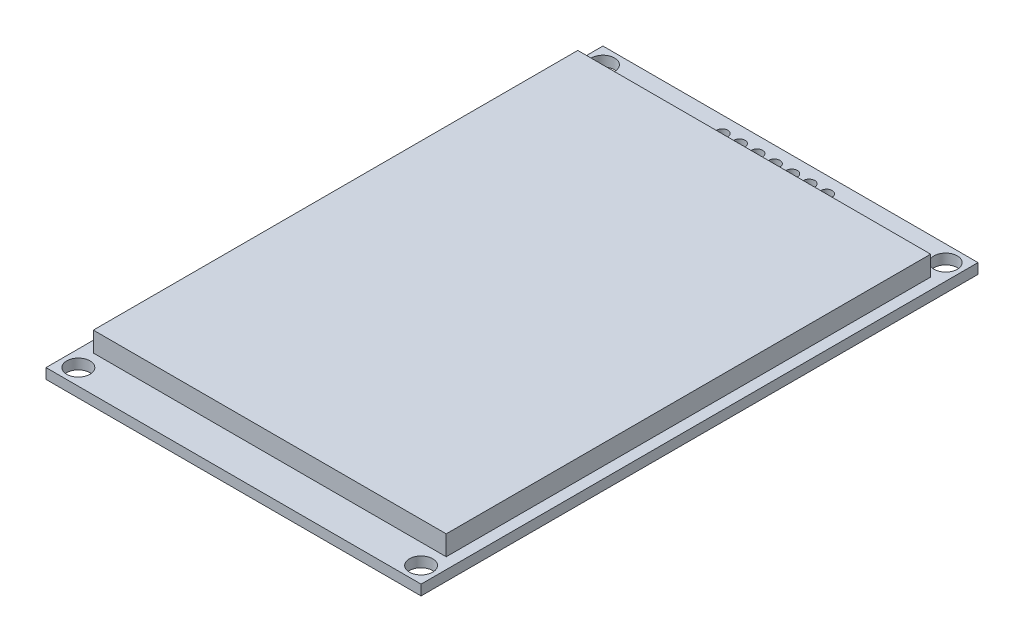
ISO-10303-21;
HEADER;
FILE_DESCRIPTION(('STEP AP214'),'2;1');
FILE_NAME('part.step','',(''),(''),'','','');
FILE_SCHEMA(('AUTOMOTIVE_DESIGN { 1 0 10303 214 1 1 1 1 }'));
ENDSEC;
DATA;
#1=APPLICATION_CONTEXT('core data for automotive mechanical design processes');
#2=APPLICATION_PROTOCOL_DEFINITION('international standard','automotive_design',2000,#1);
#3=PRODUCT_CONTEXT('',#1,'mechanical');
#4=PRODUCT('Part','Part','',(#3));
#5=PRODUCT_RELATED_PRODUCT_CATEGORY('part','',(#4));
#6=PRODUCT_DEFINITION_FORMATION('','',#4);
#7=PRODUCT_DEFINITION_CONTEXT('part definition',#1,'design');
#8=PRODUCT_DEFINITION('design','',#6,#7);
#9=PRODUCT_DEFINITION_SHAPE('','',#8);
#10=(LENGTH_UNIT() NAMED_UNIT(*) SI_UNIT(.MILLI.,.METRE.));
#11=(NAMED_UNIT(*) PLANE_ANGLE_UNIT() SI_UNIT($,.RADIAN.));
#12=(NAMED_UNIT(*) SI_UNIT($,.STERADIAN.) SOLID_ANGLE_UNIT());
#13=UNCERTAINTY_MEASURE_WITH_UNIT(LENGTH_MEASURE(1.E-05),#10,'distance_accuracy_value','');
#14=(GEOMETRIC_REPRESENTATION_CONTEXT(3) GLOBAL_UNCERTAINTY_ASSIGNED_CONTEXT((#13)) GLOBAL_UNIT_ASSIGNED_CONTEXT((#10,
#11,#12)) REPRESENTATION_CONTEXT('',''));
#15=CARTESIAN_POINT('',(0.,0.,0.));
#16=DIRECTION('',(0.,0.,1.));
#17=DIRECTION('',(1.,0.,0.));
#18=AXIS2_PLACEMENT_3D('',#15,#16,#17);
#19=CARTESIAN_POINT('',(0.,0.,0.));
#20=DIRECTION('',(0.,-1.,0.));
#21=DIRECTION('',(0.,0.,-1.));
#22=AXIS2_PLACEMENT_3D('',#19,#20,#21);
#23=PLANE('',#22);
#24=CARTESIAN_POINT('',(-25.01,0.,38.28));
#25=DIRECTION('',(0.,1.,0.));
#26=DIRECTION('',(0.,0.,-1.));
#27=AXIS2_PLACEMENT_3D('',#24,#25,#26);
#28=CIRCLE('',#27,1.7);
#29=CARTESIAN_POINT('',(-25.01,0.,36.58));
#30=VERTEX_POINT('',#29);
#31=EDGE_CURVE('E230',#30,#30,#28,.T.);
#32=ORIENTED_EDGE('',*,*,#31,.T.);
#33=EDGE_LOOP('',(#32));
#34=FACE_BOUND('',#33,.T.);
#35=CARTESIAN_POINT('',(-25.01,0.,-38.28));
#36=DIRECTION('',(0.,1.,0.));
#37=DIRECTION('',(0.,0.,1.));
#38=AXIS2_PLACEMENT_3D('',#35,#36,#37);
#39=CIRCLE('',#38,1.7);
#40=CARTESIAN_POINT('',(-25.01,0.,-36.58));
#41=VERTEX_POINT('',#40);
#42=EDGE_CURVE('E242',#41,#41,#39,.T.);
#43=ORIENTED_EDGE('',*,*,#42,.T.);
#44=EDGE_LOOP('',(#43));
#45=FACE_BOUND('',#44,.T.);
#46=DIRECTION('',(0.,0.,-1.));
#47=VECTOR('',#46,1.);
#48=CARTESIAN_POINT('',(27.37,0.,40.64));
#49=LINE('',#48,#47);
#50=CARTESIAN_POINT('',(27.37,0.,40.64));
#51=VERTEX_POINT('',#50);
#52=CARTESIAN_POINT('',(27.37,0.,-40.64));
#53=VERTEX_POINT('',#52);
#54=EDGE_CURVE('E248',#51,#53,#49,.T.);
#55=ORIENTED_EDGE('',*,*,#54,.F.);
#56=DIRECTION('',(1.,0.,0.));
#57=VECTOR('',#56,1.);
#58=CARTESIAN_POINT('',(-27.37,0.,40.64));
#59=LINE('',#58,#57);
#60=CARTESIAN_POINT('',(-27.37,0.,40.64));
#61=VERTEX_POINT('',#60);
#62=EDGE_CURVE('E255',#61,#51,#59,.T.);
#63=ORIENTED_EDGE('',*,*,#62,.F.);
#64=DIRECTION('',(0.,0.,1.));
#65=VECTOR('',#64,1.);
#66=CARTESIAN_POINT('',(-27.37,0.,40.64));
#67=LINE('',#66,#65);
#68=CARTESIAN_POINT('',(-27.37,0.,-40.64));
#69=VERTEX_POINT('',#68);
#70=EDGE_CURVE('E266',#69,#61,#67,.T.);
#71=ORIENTED_EDGE('',*,*,#70,.F.);
#72=DIRECTION('',(-1.,0.,0.));
#73=VECTOR('',#72,1.);
#74=CARTESIAN_POINT('',(-27.37,0.,-40.64));
#75=LINE('',#74,#73);
#76=EDGE_CURVE('E264',#53,#69,#75,.T.);
#77=ORIENTED_EDGE('',*,*,#76,.F.);
#78=EDGE_LOOP('',(#55,#63,#71,#77));
#79=FACE_BOUND('',#78,.T.);
#80=CARTESIAN_POINT('',(25.01,0.,-38.28));
#81=DIRECTION('',(0.,1.,0.));
#82=DIRECTION('',(0.,0.,-1.));
#83=AXIS2_PLACEMENT_3D('',#80,#81,#82);
#84=CIRCLE('',#83,1.7);
#85=CARTESIAN_POINT('',(25.01,0.,-39.98));
#86=VERTEX_POINT('',#85);
#87=EDGE_CURVE('E236',#86,#86,#84,.T.);
#88=ORIENTED_EDGE('',*,*,#87,.T.);
#89=EDGE_LOOP('',(#88));
#90=FACE_BOUND('',#89,.T.);
#91=CARTESIAN_POINT('',(25.01,0.,38.28));
#92=DIRECTION('',(0.,1.,0.));
#93=DIRECTION('',(0.,0.,1.));
#94=AXIS2_PLACEMENT_3D('',#91,#92,#93);
#95=CIRCLE('',#94,1.7);
#96=CARTESIAN_POINT('',(25.01,0.,39.98));
#97=VERTEX_POINT('',#96);
#98=EDGE_CURVE('E224',#97,#97,#95,.T.);
#99=ORIENTED_EDGE('',*,*,#98,.T.);
#100=EDGE_LOOP('',(#99));
#101=FACE_BOUND('',#100,.T.);
#102=DIRECTION('',(1.,0.,0.));
#103=VECTOR('',#102,1.);
#104=CARTESIAN_POINT('',(6.35,0.,-39.55));
#105=LINE('',#104,#103);
#106=CARTESIAN_POINT('',(-8.89,0.,-39.55));
#107=VERTEX_POINT('',#106);
#108=CARTESIAN_POINT('',(8.89,0.,-39.55));
#109=VERTEX_POINT('',#108);
#110=EDGE_CURVE('E645',#107,#109,#105,.T.);
#111=ORIENTED_EDGE('',*,*,#110,.F.);
#112=DIRECTION('',(0.,0.,-1.));
#113=VECTOR('',#112,1.);
#114=CARTESIAN_POINT('',(-8.89,0.,-39.55));
#115=LINE('',#114,#113);
#116=CARTESIAN_POINT('',(-8.89,0.,-37.01));
#117=VERTEX_POINT('',#116);
#118=EDGE_CURVE('E647',#117,#107,#115,.T.);
#119=ORIENTED_EDGE('',*,*,#118,.F.);
#120=DIRECTION('',(-1.,0.,0.));
#121=VECTOR('',#120,1.);
#122=CARTESIAN_POINT('',(-6.35,0.,-37.01));
#123=LINE('',#122,#121);
#124=CARTESIAN_POINT('',(8.89,0.,-37.01));
#125=VERTEX_POINT('',#124);
#126=EDGE_CURVE('E145',#125,#117,#123,.T.);
#127=ORIENTED_EDGE('',*,*,#126,.F.);
#128=DIRECTION('',(0.,0.,1.));
#129=VECTOR('',#128,1.);
#130=CARTESIAN_POINT('',(8.89,0.,-39.55));
#131=LINE('',#130,#129);
#132=EDGE_CURVE('E641',#109,#125,#131,.T.);
#133=ORIENTED_EDGE('',*,*,#132,.F.);
#134=EDGE_LOOP('',(#111,#119,#127,#133));
#135=FACE_BOUND('',#134,.T.);
#136=ADVANCED_FACE('F39',(#34,#45,#79,#90,#101,#135),#23,.T.);
#137=CARTESIAN_POINT('',(0.,1.5,0.));
#138=DIRECTION('',(0.,-1.,0.));
#139=DIRECTION('',(0.,0.,-1.));
#140=AXIS2_PLACEMENT_3D('',#137,#138,#139);
#141=PLANE('',#140);
#142=CARTESIAN_POINT('',(-7.62,1.5,-38.2799999999999));
#143=DIRECTION('',(0.,1.,0.));
#144=DIRECTION('',(0.,0.,1.));
#145=AXIS2_PLACEMENT_3D('',#142,#143,#144);
#146=CIRCLE('',#145,0.83);
#147=CARTESIAN_POINT('',(-7.62,1.5,-37.4499999999999));
#148=VERTEX_POINT('',#147);
#149=EDGE_CURVE('E185',#148,#148,#146,.T.);
#150=ORIENTED_EDGE('',*,*,#149,.F.);
#151=EDGE_LOOP('',(#150));
#152=FACE_BOUND('',#151,.T.);
#153=CARTESIAN_POINT('',(-5.08,1.5,-38.28));
#154=DIRECTION('',(0.,1.,0.));
#155=DIRECTION('',(0.,0.,1.));
#156=AXIS2_PLACEMENT_3D('',#153,#154,#155);
#157=CIRCLE('',#156,0.83);
#158=CARTESIAN_POINT('',(-5.08,1.5,-37.45));
#159=VERTEX_POINT('',#158);
#160=EDGE_CURVE('E191',#159,#159,#157,.T.);
#161=ORIENTED_EDGE('',*,*,#160,.F.);
#162=EDGE_LOOP('',(#161));
#163=FACE_BOUND('',#162,.T.);
#164=CARTESIAN_POINT('',(-2.54,1.5,-38.28));
#165=DIRECTION('',(0.,1.,0.));
#166=DIRECTION('',(0.,0.,1.));
#167=AXIS2_PLACEMENT_3D('',#164,#165,#166);
#168=CIRCLE('',#167,0.83);
#169=CARTESIAN_POINT('',(-2.54,1.5,-37.45));
#170=VERTEX_POINT('',#169);
#171=EDGE_CURVE('E197',#170,#170,#168,.T.);
#172=ORIENTED_EDGE('',*,*,#171,.F.);
#173=EDGE_LOOP('',(#172));
#174=FACE_BOUND('',#173,.T.);
#175=CARTESIAN_POINT('',(7.62,1.5,-38.28));
#176=DIRECTION('',(0.,1.,0.));
#177=DIRECTION('',(0.,0.,1.));
#178=AXIS2_PLACEMENT_3D('',#175,#176,#177);
#179=CIRCLE('',#178,0.83);
#180=CARTESIAN_POINT('',(7.62,1.5,-37.45));
#181=VERTEX_POINT('',#180);
#182=EDGE_CURVE('E203',#181,#181,#179,.T.);
#183=ORIENTED_EDGE('',*,*,#182,.F.);
#184=EDGE_LOOP('',(#183));
#185=FACE_BOUND('',#184,.T.);
#186=CARTESIAN_POINT('',(5.08,1.5,-38.28));
#187=DIRECTION('',(0.,1.,0.));
#188=DIRECTION('',(0.,0.,1.));
#189=AXIS2_PLACEMENT_3D('',#186,#187,#188);
#190=CIRCLE('',#189,0.83);
#191=CARTESIAN_POINT('',(5.08,1.5,-37.45));
#192=VERTEX_POINT('',#191);
#193=EDGE_CURVE('E209',#192,#192,#190,.T.);
#194=ORIENTED_EDGE('',*,*,#193,.F.);
#195=EDGE_LOOP('',(#194));
#196=FACE_BOUND('',#195,.T.);
#197=CARTESIAN_POINT('',(2.54,1.5,-38.28));
#198=DIRECTION('',(0.,1.,0.));
#199=DIRECTION('',(0.,0.,1.));
#200=AXIS2_PLACEMENT_3D('',#197,#198,#199);
#201=CIRCLE('',#200,0.83);
#202=CARTESIAN_POINT('',(2.54,1.5,-37.45));
#203=VERTEX_POINT('',#202);
#204=EDGE_CURVE('E215',#203,#203,#201,.T.);
#205=ORIENTED_EDGE('',*,*,#204,.F.);
#206=EDGE_LOOP('',(#205));
#207=FACE_BOUND('',#206,.T.);
#208=CARTESIAN_POINT('',(0.,1.5,-38.28));
#209=DIRECTION('',(0.,1.,0.));
#210=DIRECTION('',(0.,0.,1.));
#211=AXIS2_PLACEMENT_3D('',#208,#209,#210);
#212=CIRCLE('',#211,0.83);
#213=CARTESIAN_POINT('',(0.,1.5,-37.45));
#214=VERTEX_POINT('',#213);
#215=EDGE_CURVE('E221',#214,#214,#212,.T.);
#216=ORIENTED_EDGE('',*,*,#215,.F.);
#217=EDGE_LOOP('',(#216));
#218=FACE_BOUND('',#217,.T.);
#219=CARTESIAN_POINT('',(25.01,1.5,38.28));
#220=DIRECTION('',(0.,1.,0.));
#221=DIRECTION('',(0.,0.,1.));
#222=AXIS2_PLACEMENT_3D('',#219,#220,#221);
#223=CIRCLE('',#222,1.7);
#224=CARTESIAN_POINT('',(25.01,1.5,39.98));
#225=VERTEX_POINT('',#224);
#226=EDGE_CURVE('E227',#225,#225,#223,.T.);
#227=ORIENTED_EDGE('',*,*,#226,.F.);
#228=EDGE_LOOP('',(#227));
#229=FACE_BOUND('',#228,.T.);
#230=CARTESIAN_POINT('',(-25.01,1.5,38.28));
#231=DIRECTION('',(0.,1.,0.));
#232=DIRECTION('',(0.,0.,-1.));
#233=AXIS2_PLACEMENT_3D('',#230,#231,#232);
#234=CIRCLE('',#233,1.7);
#235=CARTESIAN_POINT('',(-25.01,1.5,36.58));
#236=VERTEX_POINT('',#235);
#237=EDGE_CURVE('E233',#236,#236,#234,.T.);
#238=ORIENTED_EDGE('',*,*,#237,.F.);
#239=EDGE_LOOP('',(#238));
#240=FACE_BOUND('',#239,.T.);
#241=CARTESIAN_POINT('',(25.01,1.5,-38.28));
#242=DIRECTION('',(0.,1.,0.));
#243=DIRECTION('',(0.,0.,-1.));
#244=AXIS2_PLACEMENT_3D('',#241,#242,#243);
#245=CIRCLE('',#244,1.7);
#246=CARTESIAN_POINT('',(25.01,1.5,-39.98));
#247=VERTEX_POINT('',#246);
#248=EDGE_CURVE('E239',#247,#247,#245,.T.);
#249=ORIENTED_EDGE('',*,*,#248,.F.);
#250=EDGE_LOOP('',(#249));
#251=FACE_BOUND('',#250,.T.);
#252=CARTESIAN_POINT('',(-25.01,1.5,-38.28));
#253=DIRECTION('',(0.,1.,0.));
#254=DIRECTION('',(0.,0.,1.));
#255=AXIS2_PLACEMENT_3D('',#252,#253,#254);
#256=CIRCLE('',#255,1.7);
#257=CARTESIAN_POINT('',(-25.01,1.5,-36.58));
#258=VERTEX_POINT('',#257);
#259=EDGE_CURVE('E245',#258,#258,#256,.T.);
#260=ORIENTED_EDGE('',*,*,#259,.F.);
#261=EDGE_LOOP('',(#260));
#262=FACE_BOUND('',#261,.T.);
#263=DIRECTION('',(0.,0.,-1.));
#264=VECTOR('',#263,1.);
#265=CARTESIAN_POINT('',(27.37,1.5,40.64));
#266=LINE('',#265,#264);
#267=CARTESIAN_POINT('',(27.37,1.5,40.64));
#268=VERTEX_POINT('',#267);
#269=CARTESIAN_POINT('',(27.37,1.5,-40.64));
#270=VERTEX_POINT('',#269);
#271=EDGE_CURVE('E251',#268,#270,#266,.T.);
#272=ORIENTED_EDGE('',*,*,#271,.T.);
#273=DIRECTION('',(-1.,0.,0.));
#274=VECTOR('',#273,1.);
#275=CARTESIAN_POINT('',(-27.37,1.5,-40.64));
#276=LINE('',#275,#274);
#277=CARTESIAN_POINT('',(-27.37,1.5,-40.64));
#278=VERTEX_POINT('',#277);
#279=EDGE_CURVE('E254',#270,#278,#276,.T.);
#280=ORIENTED_EDGE('',*,*,#279,.T.);
#281=DIRECTION('',(0.,0.,1.));
#282=VECTOR('',#281,1.);
#283=CARTESIAN_POINT('',(-27.37,1.5,40.64));
#284=LINE('',#283,#282);
#285=CARTESIAN_POINT('',(-27.37,1.5,40.64));
#286=VERTEX_POINT('',#285);
#287=EDGE_CURVE('E257',#278,#286,#284,.T.);
#288=ORIENTED_EDGE('',*,*,#287,.T.);
#289=DIRECTION('',(1.,0.,0.));
#290=VECTOR('',#289,1.);
#291=CARTESIAN_POINT('',(-27.37,1.5,40.64));
#292=LINE('',#291,#290);
#293=EDGE_CURVE('E259',#286,#268,#292,.T.);
#294=ORIENTED_EDGE('',*,*,#293,.T.);
#295=EDGE_LOOP('',(#272,#280,#288,#294));
#296=FACE_BOUND('',#295,.T.);
#297=DIRECTION('',(0.,0.,-1.));
#298=VECTOR('',#297,1.);
#299=CARTESIAN_POINT('',(25.75,1.5,35.35));
#300=LINE('',#299,#298);
#301=CARTESIAN_POINT('',(25.75,1.5,35.35));
#302=VERTEX_POINT('',#301);
#303=CARTESIAN_POINT('',(25.75,1.5,-35.35));
#304=VERTEX_POINT('',#303);
#305=EDGE_CURVE('E62',#302,#304,#300,.T.);
#306=ORIENTED_EDGE('',*,*,#305,.F.);
#307=DIRECTION('',(1.,0.,0.));
#308=VECTOR('',#307,1.);
#309=CARTESIAN_POINT('',(-25.75,1.5,35.35));
#310=LINE('',#309,#308);
#311=CARTESIAN_POINT('',(-25.75,1.5,35.35));
#312=VERTEX_POINT('',#311);
#313=EDGE_CURVE('E160',#312,#302,#310,.T.);
#314=ORIENTED_EDGE('',*,*,#313,.F.);
#315=DIRECTION('',(0.,0.,1.));
#316=VECTOR('',#315,1.);
#317=CARTESIAN_POINT('',(-25.75,1.5,35.35));
#318=LINE('',#317,#316);
#319=CARTESIAN_POINT('',(-25.75,1.5,-35.35));
#320=VERTEX_POINT('',#319);
#321=EDGE_CURVE('E169',#320,#312,#318,.T.);
#322=ORIENTED_EDGE('',*,*,#321,.F.);
#323=DIRECTION('',(-1.,0.,0.));
#324=VECTOR('',#323,1.);
#325=CARTESIAN_POINT('',(-25.75,1.5,-35.35));
#326=LINE('',#325,#324);
#327=EDGE_CURVE('E150',#304,#320,#326,.T.);
#328=ORIENTED_EDGE('',*,*,#327,.F.);
#329=EDGE_LOOP('',(#306,#314,#322,#328));
#330=FACE_BOUND('',#329,.T.);
#331=ADVANCED_FACE('F293',(#152,#163,#174,#185,#196,#207,#218,#229,#240,#251,#262,#296,#330),
#141,.F.);
#332=CARTESIAN_POINT('',(27.37,1.5,40.64));
#333=DIRECTION('',(-1.,0.,0.));
#334=DIRECTION('',(0.,0.,1.));
#335=AXIS2_PLACEMENT_3D('',#332,#333,#334);
#336=PLANE('',#335);
#337=ORIENTED_EDGE('',*,*,#54,.T.);
#338=DIRECTION('',(0.,-1.,0.));
#339=VECTOR('',#338,1.);
#340=CARTESIAN_POINT('',(27.37,1.5,-40.64));
#341=LINE('',#340,#339);
#342=EDGE_CURVE('E11',#270,#53,#341,.T.);
#343=ORIENTED_EDGE('',*,*,#342,.F.);
#344=ORIENTED_EDGE('',*,*,#271,.F.);
#345=DIRECTION('',(0.,-1.,0.));
#346=VECTOR('',#345,1.);
#347=CARTESIAN_POINT('',(27.37,1.5,40.64));
#348=LINE('',#347,#346);
#349=EDGE_CURVE('E261',#268,#51,#348,.T.);
#350=ORIENTED_EDGE('',*,*,#349,.T.);
#351=EDGE_LOOP('',(#337,#343,#344,#350));
#352=FACE_BOUND('',#351,.T.);
#353=ADVANCED_FACE('F41',(#352),#336,.F.);
#354=CARTESIAN_POINT('',(-27.37,1.5,-40.64));
#355=DIRECTION('',(0.,0.,1.));
#356=DIRECTION('',(1.,0.,0.));
#357=AXIS2_PLACEMENT_3D('',#354,#355,#356);
#358=PLANE('',#357);
#359=ORIENTED_EDGE('',*,*,#76,.T.);
#360=DIRECTION('',(0.,-1.,0.));
#361=VECTOR('',#360,1.);
#362=CARTESIAN_POINT('',(-27.37,1.5,-40.64));
#363=LINE('',#362,#361);
#364=EDGE_CURVE('E47',#278,#69,#363,.T.);
#365=ORIENTED_EDGE('',*,*,#364,.F.);
#366=ORIENTED_EDGE('',*,*,#279,.F.);
#367=ORIENTED_EDGE('',*,*,#342,.T.);
#368=EDGE_LOOP('',(#359,#365,#366,#367));
#369=FACE_BOUND('',#368,.T.);
#370=ADVANCED_FACE('F294',(#369),#358,.F.);
#371=CARTESIAN_POINT('',(-27.37,1.5,40.64));
#372=DIRECTION('',(1.,0.,0.));
#373=DIRECTION('',(0.,0.,-1.));
#374=AXIS2_PLACEMENT_3D('',#371,#372,#373);
#375=PLANE('',#374);
#376=ORIENTED_EDGE('',*,*,#70,.T.);
#377=DIRECTION('',(0.,-1.,0.));
#378=VECTOR('',#377,1.);
#379=CARTESIAN_POINT('',(-27.37,1.5,40.64));
#380=LINE('',#379,#378);
#381=EDGE_CURVE('E271',#286,#61,#380,.T.);
#382=ORIENTED_EDGE('',*,*,#381,.F.);
#383=ORIENTED_EDGE('',*,*,#287,.F.);
#384=ORIENTED_EDGE('',*,*,#364,.T.);
#385=EDGE_LOOP('',(#376,#382,#383,#384));
#386=FACE_BOUND('',#385,.T.);
#387=ADVANCED_FACE('F278',(#386),#375,.F.);
#388=CARTESIAN_POINT('',(-27.37,1.5,40.64));
#389=DIRECTION('',(0.,0.,-1.));
#390=DIRECTION('',(-1.,0.,0.));
#391=AXIS2_PLACEMENT_3D('',#388,#389,#390);
#392=PLANE('',#391);
#393=ORIENTED_EDGE('',*,*,#62,.T.);
#394=ORIENTED_EDGE('',*,*,#349,.F.);
#395=ORIENTED_EDGE('',*,*,#293,.F.);
#396=ORIENTED_EDGE('',*,*,#381,.T.);
#397=EDGE_LOOP('',(#393,#394,#395,#396));
#398=FACE_BOUND('',#397,.T.);
#399=ADVANCED_FACE('F287',(#398),#392,.F.);
#400=CARTESIAN_POINT('',(-25.01,1.5,-38.28));
#401=DIRECTION('',(0.,-1.,0.));
#402=DIRECTION('',(0.,0.,-1.));
#403=AXIS2_PLACEMENT_3D('',#400,#401,#402);
#404=CYLINDRICAL_SURFACE('',#403,1.7);
#405=ORIENTED_EDGE('',*,*,#259,.T.);
#406=EDGE_LOOP('',(#405));
#407=FACE_BOUND('',#406,.T.);
#408=ORIENTED_EDGE('',*,*,#42,.F.);
#409=EDGE_LOOP('',(#408));
#410=FACE_BOUND('',#409,.T.);
#411=ADVANCED_FACE('F315',(#407,#410),#404,.F.);
#412=CARTESIAN_POINT('',(25.01,1.5,-38.28));
#413=DIRECTION('',(0.,-1.,0.));
#414=DIRECTION('',(0.,0.,-1.));
#415=AXIS2_PLACEMENT_3D('',#412,#413,#414);
#416=CYLINDRICAL_SURFACE('',#415,1.7);
#417=ORIENTED_EDGE('',*,*,#248,.T.);
#418=EDGE_LOOP('',(#417));
#419=FACE_BOUND('',#418,.T.);
#420=ORIENTED_EDGE('',*,*,#87,.F.);
#421=EDGE_LOOP('',(#420));
#422=FACE_BOUND('',#421,.T.);
#423=ADVANCED_FACE('F319',(#419,#422),#416,.F.);
#424=CARTESIAN_POINT('',(-25.01,1.5,38.28));
#425=DIRECTION('',(0.,-1.,0.));
#426=DIRECTION('',(0.,0.,-1.));
#427=AXIS2_PLACEMENT_3D('',#424,#425,#426);
#428=CYLINDRICAL_SURFACE('',#427,1.7);
#429=ORIENTED_EDGE('',*,*,#237,.T.);
#430=EDGE_LOOP('',(#429));
#431=FACE_BOUND('',#430,.T.);
#432=ORIENTED_EDGE('',*,*,#31,.F.);
#433=EDGE_LOOP('',(#432));
#434=FACE_BOUND('',#433,.T.);
#435=ADVANCED_FACE('F324',(#431,#434),#428,.F.);
#436=CARTESIAN_POINT('',(25.01,1.5,38.28));
#437=DIRECTION('',(0.,-1.,0.));
#438=DIRECTION('',(0.,0.,-1.));
#439=AXIS2_PLACEMENT_3D('',#436,#437,#438);
#440=CYLINDRICAL_SURFACE('',#439,1.7);
#441=ORIENTED_EDGE('',*,*,#226,.T.);
#442=EDGE_LOOP('',(#441));
#443=FACE_BOUND('',#442,.T.);
#444=ORIENTED_EDGE('',*,*,#98,.F.);
#445=EDGE_LOOP('',(#444));
#446=FACE_BOUND('',#445,.T.);
#447=ADVANCED_FACE('F331',(#443,#446),#440,.F.);
#448=CARTESIAN_POINT('',(0.,1.5,-38.28));
#449=DIRECTION('',(0.,-1.,0.));
#450=DIRECTION('',(0.,0.,-1.));
#451=AXIS2_PLACEMENT_3D('',#448,#449,#450);
#452=CYLINDRICAL_SURFACE('',#451,0.83);
#453=ORIENTED_EDGE('',*,*,#215,.T.);
#454=EDGE_LOOP('',(#453));
#455=FACE_BOUND('',#454,.T.);
#456=CARTESIAN_POINT('',(0.,0.,-38.28));
#457=DIRECTION('',(0.,1.,0.));
#458=DIRECTION('',(0.,0.,1.));
#459=AXIS2_PLACEMENT_3D('',#456,#457,#458);
#460=CIRCLE('',#459,0.83);
#461=CARTESIAN_POINT('',(0.,0.,-37.45));
#462=VERTEX_POINT('',#461);
#463=EDGE_CURVE('E218',#462,#462,#460,.T.);
#464=ORIENTED_EDGE('',*,*,#463,.F.);
#465=EDGE_LOOP('',(#464));
#466=FACE_BOUND('',#465,.T.);
#467=ADVANCED_FACE('F335',(#455,#466),#452,.F.);
#468=CARTESIAN_POINT('',(2.54,1.5,-38.28));
#469=DIRECTION('',(0.,-1.,0.));
#470=DIRECTION('',(0.,0.,-1.));
#471=AXIS2_PLACEMENT_3D('',#468,#469,#470);
#472=CYLINDRICAL_SURFACE('',#471,0.83);
#473=ORIENTED_EDGE('',*,*,#204,.T.);
#474=EDGE_LOOP('',(#473));
#475=FACE_BOUND('',#474,.T.);
#476=CARTESIAN_POINT('',(2.54,0.,-38.28));
#477=DIRECTION('',(0.,1.,0.));
#478=DIRECTION('',(0.,0.,1.));
#479=AXIS2_PLACEMENT_3D('',#476,#477,#478);
#480=CIRCLE('',#479,0.83);
#481=CARTESIAN_POINT('',(2.54,0.,-37.45));
#482=VERTEX_POINT('',#481);
#483=EDGE_CURVE('E212',#482,#482,#480,.T.);
#484=ORIENTED_EDGE('',*,*,#483,.F.);
#485=EDGE_LOOP('',(#484));
#486=FACE_BOUND('',#485,.T.);
#487=ADVANCED_FACE('F339',(#475,#486),#472,.F.);
#488=CARTESIAN_POINT('',(5.08,1.5,-38.28));
#489=DIRECTION('',(0.,-1.,0.));
#490=DIRECTION('',(0.,0.,-1.));
#491=AXIS2_PLACEMENT_3D('',#488,#489,#490);
#492=CYLINDRICAL_SURFACE('',#491,0.83);
#493=ORIENTED_EDGE('',*,*,#193,.T.);
#494=EDGE_LOOP('',(#493));
#495=FACE_BOUND('',#494,.T.);
#496=CARTESIAN_POINT('',(5.08,0.,-38.28));
#497=DIRECTION('',(0.,1.,0.));
#498=DIRECTION('',(0.,0.,1.));
#499=AXIS2_PLACEMENT_3D('',#496,#497,#498);
#500=CIRCLE('',#499,0.83);
#501=CARTESIAN_POINT('',(5.08,0.,-37.45));
#502=VERTEX_POINT('',#501);
#503=EDGE_CURVE('E206',#502,#502,#500,.T.);
#504=ORIENTED_EDGE('',*,*,#503,.F.);
#505=EDGE_LOOP('',(#504));
#506=FACE_BOUND('',#505,.T.);
#507=ADVANCED_FACE('F343',(#495,#506),#492,.F.);
#508=CARTESIAN_POINT('',(7.62,1.5,-38.28));
#509=DIRECTION('',(0.,-1.,0.));
#510=DIRECTION('',(0.,0.,-1.));
#511=AXIS2_PLACEMENT_3D('',#508,#509,#510);
#512=CYLINDRICAL_SURFACE('',#511,0.83);
#513=ORIENTED_EDGE('',*,*,#182,.T.);
#514=EDGE_LOOP('',(#513));
#515=FACE_BOUND('',#514,.T.);
#516=CARTESIAN_POINT('',(7.62,0.,-38.28));
#517=DIRECTION('',(0.,1.,0.));
#518=DIRECTION('',(0.,0.,1.));
#519=AXIS2_PLACEMENT_3D('',#516,#517,#518);
#520=CIRCLE('',#519,0.83);
#521=CARTESIAN_POINT('',(7.62,0.,-37.45));
#522=VERTEX_POINT('',#521);
#523=EDGE_CURVE('E200',#522,#522,#520,.T.);
#524=ORIENTED_EDGE('',*,*,#523,.F.);
#525=EDGE_LOOP('',(#524));
#526=FACE_BOUND('',#525,.T.);
#527=ADVANCED_FACE('F347',(#515,#526),#512,.F.);
#528=CARTESIAN_POINT('',(-2.54,1.5,-38.28));
#529=DIRECTION('',(0.,-1.,0.));
#530=DIRECTION('',(0.,0.,-1.));
#531=AXIS2_PLACEMENT_3D('',#528,#529,#530);
#532=CYLINDRICAL_SURFACE('',#531,0.83);
#533=ORIENTED_EDGE('',*,*,#171,.T.);
#534=EDGE_LOOP('',(#533));
#535=FACE_BOUND('',#534,.T.);
#536=CARTESIAN_POINT('',(-2.54,0.,-38.28));
#537=DIRECTION('',(0.,1.,0.));
#538=DIRECTION('',(0.,0.,1.));
#539=AXIS2_PLACEMENT_3D('',#536,#537,#538);
#540=CIRCLE('',#539,0.83);
#541=CARTESIAN_POINT('',(-2.54,0.,-37.45));
#542=VERTEX_POINT('',#541);
#543=EDGE_CURVE('E194',#542,#542,#540,.T.);
#544=ORIENTED_EDGE('',*,*,#543,.F.);
#545=EDGE_LOOP('',(#544));
#546=FACE_BOUND('',#545,.T.);
#547=ADVANCED_FACE('F351',(#535,#546),#532,.F.);
#548=CARTESIAN_POINT('',(-5.08,1.5,-38.28));
#549=DIRECTION('',(0.,-1.,0.));
#550=DIRECTION('',(0.,0.,-1.));
#551=AXIS2_PLACEMENT_3D('',#548,#549,#550);
#552=CYLINDRICAL_SURFACE('',#551,0.83);
#553=ORIENTED_EDGE('',*,*,#160,.T.);
#554=EDGE_LOOP('',(#553));
#555=FACE_BOUND('',#554,.T.);
#556=CARTESIAN_POINT('',(-5.08,0.,-38.28));
#557=DIRECTION('',(0.,1.,0.));
#558=DIRECTION('',(0.,0.,1.));
#559=AXIS2_PLACEMENT_3D('',#556,#557,#558);
#560=CIRCLE('',#559,0.83);
#561=CARTESIAN_POINT('',(-5.08,0.,-37.45));
#562=VERTEX_POINT('',#561);
#563=EDGE_CURVE('E188',#562,#562,#560,.T.);
#564=ORIENTED_EDGE('',*,*,#563,.F.);
#565=EDGE_LOOP('',(#564));
#566=FACE_BOUND('',#565,.T.);
#567=ADVANCED_FACE('F355',(#555,#566),#552,.F.);
#568=CARTESIAN_POINT('',(-7.62,1.5,-38.2799999999999));
#569=DIRECTION('',(0.,-1.,0.));
#570=DIRECTION('',(0.,0.,-1.));
#571=AXIS2_PLACEMENT_3D('',#568,#569,#570);
#572=CYLINDRICAL_SURFACE('',#571,0.83);
#573=ORIENTED_EDGE('',*,*,#149,.T.);
#574=EDGE_LOOP('',(#573));
#575=FACE_BOUND('',#574,.T.);
#576=CARTESIAN_POINT('',(-7.62,0.,-38.2799999999999));
#577=DIRECTION('',(0.,1.,0.));
#578=DIRECTION('',(0.,0.,1.));
#579=AXIS2_PLACEMENT_3D('',#576,#577,#578);
#580=CIRCLE('',#579,0.83);
#581=CARTESIAN_POINT('',(-7.62,0.,-37.4499999999999));
#582=VERTEX_POINT('',#581);
#583=EDGE_CURVE('E184',#582,#582,#580,.T.);
#584=ORIENTED_EDGE('',*,*,#583,.F.);
#585=EDGE_LOOP('',(#584));
#586=FACE_BOUND('',#585,.T.);
#587=ADVANCED_FACE('F359',(#575,#586),#572,.F.);
#588=CARTESIAN_POINT('',(25.75,4.4,35.35));
#589=DIRECTION('',(-1.,0.,0.));
#590=DIRECTION('',(0.,0.,1.));
#591=AXIS2_PLACEMENT_3D('',#588,#589,#590);
#592=PLANE('',#591);
#593=ORIENTED_EDGE('',*,*,#305,.T.);
#594=DIRECTION('',(0.,-1.,0.));
#595=VECTOR('',#594,1.);
#596=CARTESIAN_POINT('',(25.75,4.4,-35.35));
#597=LINE('',#596,#595);
#598=CARTESIAN_POINT('',(25.75,4.4,-35.35));
#599=VERTEX_POINT('',#598);
#600=EDGE_CURVE('E181',#599,#304,#597,.T.);
#601=ORIENTED_EDGE('',*,*,#600,.F.);
#602=DIRECTION('',(0.,0.,-1.));
#603=VECTOR('',#602,1.);
#604=CARTESIAN_POINT('',(25.75,4.4,35.35));
#605=LINE('',#604,#603);
#606=CARTESIAN_POINT('',(25.75,4.4,35.35));
#607=VERTEX_POINT('',#606);
#608=EDGE_CURVE('E156',#607,#599,#605,.T.);
#609=ORIENTED_EDGE('',*,*,#608,.F.);
#610=DIRECTION('',(0.,-1.,0.));
#611=VECTOR('',#610,1.);
#612=CARTESIAN_POINT('',(25.75,4.4,35.35));
#613=LINE('',#612,#611);
#614=EDGE_CURVE('E165',#607,#302,#613,.T.);
#615=ORIENTED_EDGE('',*,*,#614,.T.);
#616=EDGE_LOOP('',(#593,#601,#609,#615));
#617=FACE_BOUND('',#616,.T.);
#618=ADVANCED_FACE('F363',(#617),#592,.F.);
#619=CARTESIAN_POINT('',(-25.75,4.4,-35.35));
#620=DIRECTION('',(0.,0.,1.));
#621=DIRECTION('',(1.,0.,0.));
#622=AXIS2_PLACEMENT_3D('',#619,#620,#621);
#623=PLANE('',#622);
#624=ORIENTED_EDGE('',*,*,#327,.T.);
#625=DIRECTION('',(0.,-1.,0.));
#626=VECTOR('',#625,1.);
#627=CARTESIAN_POINT('',(-25.75,4.4,-35.35));
#628=LINE('',#627,#626);
#629=CARTESIAN_POINT('',(-25.75,4.4,-35.35));
#630=VERTEX_POINT('',#629);
#631=EDGE_CURVE('E178',#630,#320,#628,.T.);
#632=ORIENTED_EDGE('',*,*,#631,.F.);
#633=DIRECTION('',(-1.,0.,0.));
#634=VECTOR('',#633,1.);
#635=CARTESIAN_POINT('',(-25.75,4.4,-35.35));
#636=LINE('',#635,#634);
#637=EDGE_CURVE('E159',#599,#630,#636,.T.);
#638=ORIENTED_EDGE('',*,*,#637,.F.);
#639=ORIENTED_EDGE('',*,*,#600,.T.);
#640=EDGE_LOOP('',(#624,#632,#638,#639));
#641=FACE_BOUND('',#640,.T.);
#642=ADVANCED_FACE('F367',(#641),#623,.F.);
#643=CARTESIAN_POINT('',(-25.75,4.4,35.35));
#644=DIRECTION('',(1.,0.,0.));
#645=DIRECTION('',(0.,0.,-1.));
#646=AXIS2_PLACEMENT_3D('',#643,#644,#645);
#647=PLANE('',#646);
#648=ORIENTED_EDGE('',*,*,#321,.T.);
#649=DIRECTION('',(0.,-1.,0.));
#650=VECTOR('',#649,1.);
#651=CARTESIAN_POINT('',(-25.75,4.4,35.35));
#652=LINE('',#651,#650);
#653=CARTESIAN_POINT('',(-25.75,4.4,35.35));
#654=VERTEX_POINT('',#653);
#655=EDGE_CURVE('E175',#654,#312,#652,.T.);
#656=ORIENTED_EDGE('',*,*,#655,.F.);
#657=DIRECTION('',(0.,0.,1.));
#658=VECTOR('',#657,1.);
#659=CARTESIAN_POINT('',(-25.75,4.4,35.35));
#660=LINE('',#659,#658);
#661=EDGE_CURVE('E162',#630,#654,#660,.T.);
#662=ORIENTED_EDGE('',*,*,#661,.F.);
#663=ORIENTED_EDGE('',*,*,#631,.T.);
#664=EDGE_LOOP('',(#648,#656,#662,#663));
#665=FACE_BOUND('',#664,.T.);
#666=ADVANCED_FACE('F371',(#665),#647,.F.);
#667=CARTESIAN_POINT('',(-25.75,4.4,35.35));
#668=DIRECTION('',(0.,0.,-1.));
#669=DIRECTION('',(-1.,0.,0.));
#670=AXIS2_PLACEMENT_3D('',#667,#668,#669);
#671=PLANE('',#670);
#672=ORIENTED_EDGE('',*,*,#313,.T.);
#673=ORIENTED_EDGE('',*,*,#614,.F.);
#674=DIRECTION('',(1.,0.,0.));
#675=VECTOR('',#674,1.);
#676=CARTESIAN_POINT('',(-25.75,4.4,35.35));
#677=LINE('',#676,#675);
#678=EDGE_CURVE('E164',#654,#607,#677,.T.);
#679=ORIENTED_EDGE('',*,*,#678,.F.);
#680=ORIENTED_EDGE('',*,*,#655,.T.);
#681=EDGE_LOOP('',(#672,#673,#679,#680));
#682=FACE_BOUND('',#681,.T.);
#683=ADVANCED_FACE('F375',(#682),#671,.F.);
#684=CARTESIAN_POINT('',(0.,4.4,0.));
#685=DIRECTION('',(0.,-1.,0.));
#686=DIRECTION('',(0.,0.,-1.));
#687=AXIS2_PLACEMENT_3D('',#684,#685,#686);
#688=PLANE('',#687);
#689=ORIENTED_EDGE('',*,*,#608,.T.);
#690=ORIENTED_EDGE('',*,*,#637,.T.);
#691=ORIENTED_EDGE('',*,*,#661,.T.);
#692=ORIENTED_EDGE('',*,*,#678,.T.);
#693=EDGE_LOOP('',(#689,#690,#691,#692));
#694=FACE_BOUND('',#693,.T.);
#695=ADVANCED_FACE('F379',(#694),#688,.F.);
#696=CARTESIAN_POINT('',(0.,0.,0.));
#697=DIRECTION('',(0.,-1.,0.));
#698=DIRECTION('',(0.,0.,-1.));
#699=AXIS2_PLACEMENT_3D('',#696,#697,#698);
#700=PLANE('',#699);
#701=ORIENTED_EDGE('',*,*,#583,.T.);
#702=EDGE_LOOP('',(#701));
#703=FACE_BOUND('',#702,.T.);
#704=ADVANCED_FACE('F382',(#703),#700,.F.);
#705=ORIENTED_EDGE('',*,*,#563,.T.);
#706=EDGE_LOOP('',(#705));
#707=FACE_BOUND('',#706,.T.);
#708=ADVANCED_FACE('F462',(#707),#700,.F.);
#709=ORIENTED_EDGE('',*,*,#543,.T.);
#710=EDGE_LOOP('',(#709));
#711=FACE_BOUND('',#710,.T.);
#712=ADVANCED_FACE('F454',(#711),#700,.F.);
#713=ORIENTED_EDGE('',*,*,#523,.T.);
#714=EDGE_LOOP('',(#713));
#715=FACE_BOUND('',#714,.T.);
#716=ADVANCED_FACE('F446',(#715),#700,.F.);
#717=ORIENTED_EDGE('',*,*,#503,.T.);
#718=EDGE_LOOP('',(#717));
#719=FACE_BOUND('',#718,.T.);
#720=ADVANCED_FACE('F438',(#719),#700,.F.);
#721=ORIENTED_EDGE('',*,*,#483,.T.);
#722=EDGE_LOOP('',(#721));
#723=FACE_BOUND('',#722,.T.);
#724=ADVANCED_FACE('F399',(#723),#700,.F.);
#725=ORIENTED_EDGE('',*,*,#463,.T.);
#726=EDGE_LOOP('',(#725));
#727=FACE_BOUND('',#726,.T.);
#728=ADVANCED_FACE('F387',(#727),#700,.F.);
#729=CARTESIAN_POINT('',(-8.89,-2.54,-39.55));
#730=DIRECTION('',(1.,0.,0.));
#731=DIRECTION('',(0.,0.,-1.));
#732=AXIS2_PLACEMENT_3D('',#729,#730,#731);
#733=PLANE('',#732);
#734=ORIENTED_EDGE('',*,*,#118,.T.);
#735=DIRECTION('',(0.,1.,0.));
#736=VECTOR('',#735,1.);
#737=CARTESIAN_POINT('',(-8.89,-2.54,-39.55));
#738=LINE('',#737,#736);
#739=CARTESIAN_POINT('',(-8.89,-2.54,-39.55));
#740=VERTEX_POINT('',#739);
#741=EDGE_CURVE('E135',#740,#107,#738,.T.);
#742=ORIENTED_EDGE('',*,*,#741,.F.);
#743=DIRECTION('',(0.,0.,-1.));
#744=VECTOR('',#743,1.);
#745=CARTESIAN_POINT('',(-8.89,-2.54,-39.55));
#746=LINE('',#745,#744);
#747=CARTESIAN_POINT('',(-8.89,-2.54,-37.01));
#748=VERTEX_POINT('',#747);
#749=EDGE_CURVE('E128',#748,#740,#746,.T.);
#750=ORIENTED_EDGE('',*,*,#749,.F.);
#751=DIRECTION('',(0.,1.,0.));
#752=VECTOR('',#751,1.);
#753=CARTESIAN_POINT('',(-8.89,-2.54,-37.01));
#754=LINE('',#753,#752);
#755=EDGE_CURVE('E132',#748,#117,#754,.T.);
#756=ORIENTED_EDGE('',*,*,#755,.T.);
#757=EDGE_LOOP('',(#734,#742,#750,#756));
#758=FACE_BOUND('',#757,.T.);
#759=ADVANCED_FACE('F130',(#758),#733,.F.);
#760=CARTESIAN_POINT('',(6.35,-2.54,-39.55));
#761=DIRECTION('',(0.,0.,1.));
#762=DIRECTION('',(1.,0.,0.));
#763=AXIS2_PLACEMENT_3D('',#760,#761,#762);
#764=PLANE('',#763);
#765=ORIENTED_EDGE('',*,*,#110,.T.);
#766=DIRECTION('',(0.,1.,0.));
#767=VECTOR('',#766,1.);
#768=CARTESIAN_POINT('',(8.89,-2.54,-39.55));
#769=LINE('',#768,#767);
#770=CARTESIAN_POINT('',(8.89,-2.54,-39.55));
#771=VERTEX_POINT('',#770);
#772=EDGE_CURVE('E152',#771,#109,#769,.T.);
#773=ORIENTED_EDGE('',*,*,#772,.F.);
#774=DIRECTION('',(1.,0.,0.));
#775=VECTOR('',#774,1.);
#776=CARTESIAN_POINT('',(-8.89,-2.54,-39.55));
#777=LINE('',#776,#775);
#778=EDGE_CURVE('E138',#740,#771,#777,.T.);
#779=ORIENTED_EDGE('',*,*,#778,.F.);
#780=ORIENTED_EDGE('',*,*,#741,.T.);
#781=EDGE_LOOP('',(#765,#773,#779,#780));
#782=FACE_BOUND('',#781,.T.);
#783=ADVANCED_FACE('F386',(#782),#764,.F.);
#784=CARTESIAN_POINT('',(8.89,-2.54,-39.55));
#785=DIRECTION('',(-1.,0.,0.));
#786=DIRECTION('',(0.,0.,1.));
#787=AXIS2_PLACEMENT_3D('',#784,#785,#786);
#788=PLANE('',#787);
#789=ORIENTED_EDGE('',*,*,#132,.T.);
#790=DIRECTION('',(0.,1.,0.));
#791=VECTOR('',#790,1.);
#792=CARTESIAN_POINT('',(8.89,-2.54,-37.01));
#793=LINE('',#792,#791);
#794=CARTESIAN_POINT('',(8.89,-2.54,-37.01));
#795=VERTEX_POINT('',#794);
#796=EDGE_CURVE('E54',#795,#125,#793,.T.);
#797=ORIENTED_EDGE('',*,*,#796,.F.);
#798=DIRECTION('',(0.,0.,1.));
#799=VECTOR('',#798,1.);
#800=CARTESIAN_POINT('',(8.89,-2.54,-39.55));
#801=LINE('',#800,#799);
#802=EDGE_CURVE('E144',#771,#795,#801,.T.);
#803=ORIENTED_EDGE('',*,*,#802,.F.);
#804=ORIENTED_EDGE('',*,*,#772,.T.);
#805=EDGE_LOOP('',(#789,#797,#803,#804));
#806=FACE_BOUND('',#805,.T.);
#807=ADVANCED_FACE('F390',(#806),#788,.F.);
#808=CARTESIAN_POINT('',(-6.35,-2.54,-37.01));
#809=DIRECTION('',(0.,0.,-1.));
#810=DIRECTION('',(-1.,0.,0.));
#811=AXIS2_PLACEMENT_3D('',#808,#809,#810);
#812=PLANE('',#811);
#813=ORIENTED_EDGE('',*,*,#126,.T.);
#814=ORIENTED_EDGE('',*,*,#755,.F.);
#815=DIRECTION('',(-1.,0.,0.));
#816=VECTOR('',#815,1.);
#817=CARTESIAN_POINT('',(-8.89,-2.54,-37.01));
#818=LINE('',#817,#816);
#819=EDGE_CURVE('E139',#795,#748,#818,.T.);
#820=ORIENTED_EDGE('',*,*,#819,.F.);
#821=ORIENTED_EDGE('',*,*,#796,.T.);
#822=EDGE_LOOP('',(#813,#814,#820,#821));
#823=FACE_BOUND('',#822,.T.);
#824=ADVANCED_FACE('F147',(#823),#812,.F.);
#825=CARTESIAN_POINT('',(0.,-2.54,0.));
#826=DIRECTION('',(0.,-1.,0.));
#827=DIRECTION('',(0.,0.,-1.));
#828=AXIS2_PLACEMENT_3D('',#825,#826,#827);
#829=PLANE('',#828);
#830=ORIENTED_EDGE('',*,*,#819,.T.);
#831=ORIENTED_EDGE('',*,*,#749,.T.);
#832=ORIENTED_EDGE('',*,*,#778,.T.);
#833=ORIENTED_EDGE('',*,*,#802,.T.);
#834=EDGE_LOOP('',(#830,#831,#832,#833));
#835=FACE_BOUND('',#834,.T.);
#836=ADVANCED_FACE('F142',(#835),#829,.T.);
#837=CLOSED_SHELL('',(#136,#331,#353,#370,#387,#399,#411,#423,#435,#447,#467,#487,#507,#527,
#547,#567,#587,#618,#642,#666,#683,#695,#704,#708,#712,#716,#720,#724,#728,#759,#783,#807,#824,#836));
#838=MANIFOLD_SOLID_BREP('B2',#837);
#839=ADVANCED_BREP_SHAPE_REPRESENTATION('',(#18,#838),#14);
#840=SHAPE_DEFINITION_REPRESENTATION(#9,#839);
ENDSEC;
END-ISO-10303-21;
